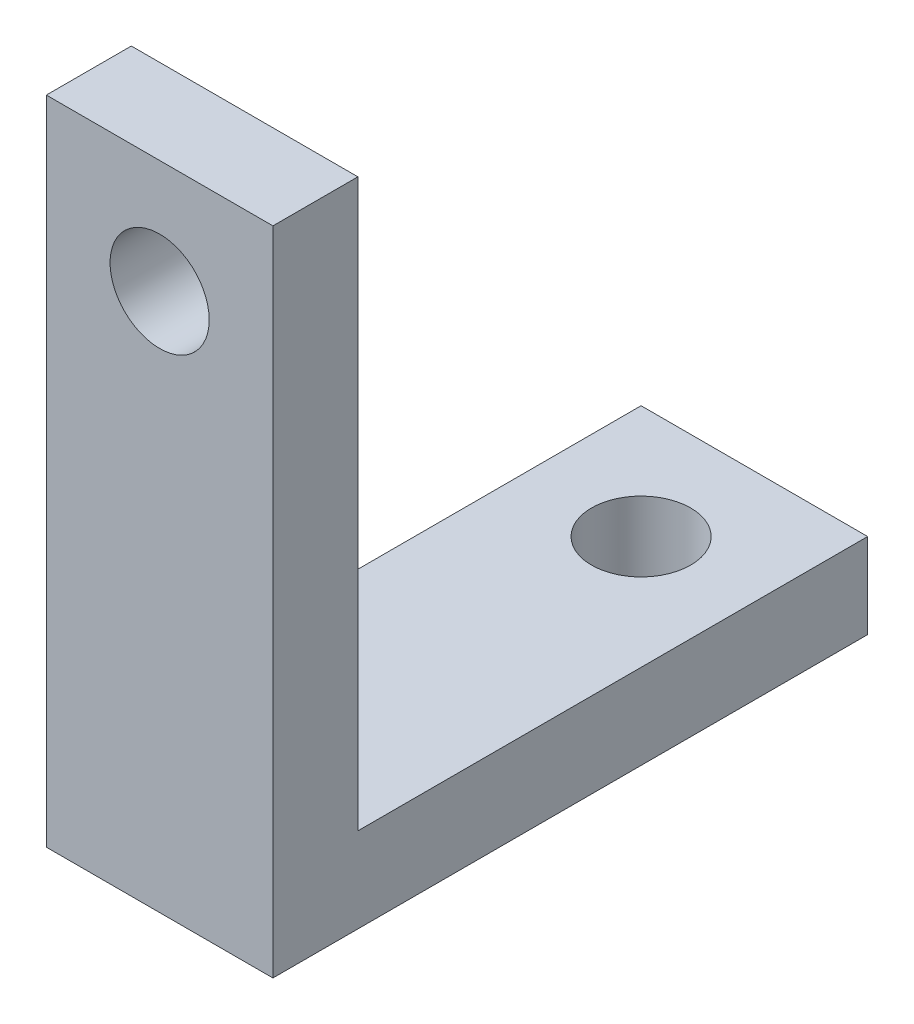
ISO-10303-21;
HEADER;
FILE_DESCRIPTION(('STEP AP214'),'2;1');
FILE_NAME('part.step','',(''),(''),'','','');
FILE_SCHEMA(('AUTOMOTIVE_DESIGN { 1 0 10303 214 1 1 1 1 }'));
ENDSEC;
DATA;
#1=APPLICATION_CONTEXT('core data for automotive mechanical design processes');
#2=APPLICATION_PROTOCOL_DEFINITION('international standard','automotive_design',2000,#1);
#3=PRODUCT_CONTEXT('',#1,'mechanical');
#4=PRODUCT('Part','Part','',(#3));
#5=PRODUCT_RELATED_PRODUCT_CATEGORY('part','',(#4));
#6=PRODUCT_DEFINITION_FORMATION('','',#4);
#7=PRODUCT_DEFINITION_CONTEXT('part definition',#1,'design');
#8=PRODUCT_DEFINITION('design','',#6,#7);
#9=PRODUCT_DEFINITION_SHAPE('','',#8);
#10=(LENGTH_UNIT() NAMED_UNIT(*) SI_UNIT(.MILLI.,.METRE.));
#11=(NAMED_UNIT(*) PLANE_ANGLE_UNIT() SI_UNIT($,.RADIAN.));
#12=(NAMED_UNIT(*) SI_UNIT($,.STERADIAN.) SOLID_ANGLE_UNIT());
#13=UNCERTAINTY_MEASURE_WITH_UNIT(LENGTH_MEASURE(1.E-05),#10,'distance_accuracy_value','');
#14=(GEOMETRIC_REPRESENTATION_CONTEXT(3) GLOBAL_UNCERTAINTY_ASSIGNED_CONTEXT((#13)) GLOBAL_UNIT_ASSIGNED_CONTEXT((#10,
#11,#12)) REPRESENTATION_CONTEXT('',''));
#15=CARTESIAN_POINT('',(0.,0.,0.));
#16=DIRECTION('',(0.,0.,1.));
#17=DIRECTION('',(1.,0.,0.));
#18=AXIS2_PLACEMENT_3D('',#15,#16,#17);
#19=CARTESIAN_POINT('',(0.,0.,0.));
#20=DIRECTION('',(0.,0.,1.));
#21=DIRECTION('',(1.,0.,0.));
#22=AXIS2_PLACEMENT_3D('',#19,#20,#21);
#23=PLANE('',#22);
#24=CARTESIAN_POINT('',(-48.2175292479687,13.1569331292858,0.));
#25=DIRECTION('',(0.,0.,1.));
#26=DIRECTION('',(1.,0.,0.));
#27=AXIS2_PLACEMENT_3D('',#24,#25,#26);
#28=CIRCLE('',#27,1.75);
#29=CARTESIAN_POINT('',(-46.4675292479687,13.1569331292858,0.));
#30=VERTEX_POINT('',#29);
#31=EDGE_CURVE('E147',#30,#30,#28,.T.);
#32=ORIENTED_EDGE('',*,*,#31,.T.);
#33=EDGE_LOOP('',(#32));
#34=FACE_BOUND('',#33,.T.);
#35=DIRECTION('',(1.,0.,0.));
#36=VECTOR('',#35,1.);
#37=CARTESIAN_POINT('',(-44.2175292479687,-2.84306687071421,0.));
#38=LINE('',#37,#36);
#39=CARTESIAN_POINT('',(-52.2175292479687,-2.84306687071421,0.));
#40=VERTEX_POINT('',#39);
#41=CARTESIAN_POINT('',(-44.2175292479687,-2.84306687071421,0.));
#42=VERTEX_POINT('',#41);
#43=EDGE_CURVE('E48',#40,#42,#38,.T.);
#44=ORIENTED_EDGE('',*,*,#43,.F.);
#45=DIRECTION('',(0.,-1.,0.));
#46=VECTOR('',#45,1.);
#47=CARTESIAN_POINT('',(-52.2175292479687,17.1569331292858,0.));
#48=LINE('',#47,#46);
#49=CARTESIAN_POINT('',(-52.2175292479687,17.1569331292858,0.));
#50=VERTEX_POINT('',#49);
#51=EDGE_CURVE('E116',#50,#40,#48,.T.);
#52=ORIENTED_EDGE('',*,*,#51,.F.);
#53=DIRECTION('',(-1.,0.,0.));
#54=VECTOR('',#53,1.);
#55=CARTESIAN_POINT('',(-52.2175292479687,17.1569331292858,0.));
#56=LINE('',#55,#54);
#57=CARTESIAN_POINT('',(-44.2175292479687,17.1569331292858,0.));
#58=VERTEX_POINT('',#57);
#59=EDGE_CURVE('E72',#58,#50,#56,.T.);
#60=ORIENTED_EDGE('',*,*,#59,.F.);
#61=DIRECTION('',(0.,1.,0.));
#62=VECTOR('',#61,1.);
#63=CARTESIAN_POINT('',(-44.2175292479687,17.1569331292858,0.));
#64=LINE('',#63,#62);
#65=EDGE_CURVE('E118',#42,#58,#64,.T.);
#66=ORIENTED_EDGE('',*,*,#65,.F.);
#67=EDGE_LOOP('',(#44,#52,#60,#66));
#68=FACE_BOUND('',#67,.T.);
#69=ADVANCED_FACE('F32',(#34,#68),#23,.F.);
#70=CARTESIAN_POINT('',(-52.2175292479687,17.1569331292858,3.));
#71=DIRECTION('',(1.,0.,0.));
#72=DIRECTION('',(0.,0.,-1.));
#73=AXIS2_PLACEMENT_3D('',#70,#71,#72);
#74=PLANE('',#73);
#75=ORIENTED_EDGE('',*,*,#51,.T.);
#76=DIRECTION('',(0.,0.,1.));
#77=VECTOR('',#76,1.);
#78=CARTESIAN_POINT('',(-52.2175292479687,-2.84306687071421,-18.));
#79=LINE('',#78,#77);
#80=CARTESIAN_POINT('',(-52.2175292479687,-2.84306687071421,-18.));
#81=VERTEX_POINT('',#80);
#82=EDGE_CURVE('E99',#81,#40,#79,.T.);
#83=ORIENTED_EDGE('',*,*,#82,.F.);
#84=DIRECTION('',(0.,1.,0.));
#85=VECTOR('',#84,1.);
#86=CARTESIAN_POINT('',(-52.2175292479687,-2.84306687071421,-18.));
#87=LINE('',#86,#85);
#88=CARTESIAN_POINT('',(-52.2175292479687,-5.84306687071421,-18.));
#89=VERTEX_POINT('',#88);
#90=EDGE_CURVE('E106',#89,#81,#87,.T.);
#91=ORIENTED_EDGE('',*,*,#90,.F.);
#92=DIRECTION('',(0.,0.,-1.));
#93=VECTOR('',#92,1.);
#94=CARTESIAN_POINT('',(-52.2175292479687,-5.84306687071421,3.));
#95=LINE('',#94,#93);
#96=CARTESIAN_POINT('',(-52.2175292479687,-5.84306687071421,3.));
#97=VERTEX_POINT('',#96);
#98=EDGE_CURVE('E11',#97,#89,#95,.T.);
#99=ORIENTED_EDGE('',*,*,#98,.F.);
#100=DIRECTION('',(0.,-1.,0.));
#101=VECTOR('',#100,1.);
#102=CARTESIAN_POINT('',(-52.2175292479687,17.1569331292858,3.));
#103=LINE('',#102,#101);
#104=CARTESIAN_POINT('',(-52.2175292479687,17.1569331292858,3.));
#105=VERTEX_POINT('',#104);
#106=EDGE_CURVE('E123',#105,#97,#103,.T.);
#107=ORIENTED_EDGE('',*,*,#106,.F.);
#108=DIRECTION('',(0.,0.,-1.));
#109=VECTOR('',#108,1.);
#110=CARTESIAN_POINT('',(-52.2175292479687,17.1569331292858,3.));
#111=LINE('',#110,#109);
#112=EDGE_CURVE('E128',#105,#50,#111,.T.);
#113=ORIENTED_EDGE('',*,*,#112,.T.);
#114=EDGE_LOOP('',(#75,#83,#91,#99,#107,#113));
#115=FACE_BOUND('',#114,.T.);
#116=ADVANCED_FACE('F34',(#115),#74,.F.);
#117=CARTESIAN_POINT('',(-52.2175292479687,-5.84306687071421,3.));
#118=DIRECTION('',(0.,1.,0.));
#119=DIRECTION('',(0.,0.,1.));
#120=AXIS2_PLACEMENT_3D('',#117,#118,#119);
#121=PLANE('',#120);
#122=CARTESIAN_POINT('',(-48.2175292479687,-5.84306687071421,-14.));
#123=DIRECTION('',(0.,-1.,0.));
#124=DIRECTION('',(0.,0.,-1.));
#125=AXIS2_PLACEMENT_3D('',#122,#123,#124);
#126=CIRCLE('',#125,1.75);
#127=CARTESIAN_POINT('',(-48.2175292479687,-5.84306687071421,-15.75));
#128=VERTEX_POINT('',#127);
#129=EDGE_CURVE('E143',#128,#128,#126,.T.);
#130=ORIENTED_EDGE('',*,*,#129,.F.);
#131=EDGE_LOOP('',(#130));
#132=FACE_BOUND('',#131,.T.);
#133=ORIENTED_EDGE('',*,*,#98,.T.);
#134=DIRECTION('',(-1.,0.,0.));
#135=VECTOR('',#134,1.);
#136=CARTESIAN_POINT('',(-52.2175292479687,-5.84306687071421,-18.));
#137=LINE('',#136,#135);
#138=CARTESIAN_POINT('',(-44.2175292479687,-5.84306687071421,-18.));
#139=VERTEX_POINT('',#138);
#140=EDGE_CURVE('E112',#139,#89,#137,.T.);
#141=ORIENTED_EDGE('',*,*,#140,.F.);
#142=DIRECTION('',(0.,0.,-1.));
#143=VECTOR('',#142,1.);
#144=CARTESIAN_POINT('',(-44.2175292479687,-5.84306687071421,3.));
#145=LINE('',#144,#143);
#146=CARTESIAN_POINT('',(-44.2175292479687,-5.84306687071421,3.));
#147=VERTEX_POINT('',#146);
#148=EDGE_CURVE('E41',#147,#139,#145,.T.);
#149=ORIENTED_EDGE('',*,*,#148,.F.);
#150=DIRECTION('',(1.,0.,0.));
#151=VECTOR('',#150,1.);
#152=CARTESIAN_POINT('',(-52.2175292479687,-5.84306687071421,3.));
#153=LINE('',#152,#151);
#154=EDGE_CURVE('E79',#97,#147,#153,.T.);
#155=ORIENTED_EDGE('',*,*,#154,.F.);
#156=EDGE_LOOP('',(#133,#141,#149,#155));
#157=FACE_BOUND('',#156,.T.);
#158=ADVANCED_FACE('F140',(#132,#157),#121,.F.);
#159=CARTESIAN_POINT('',(-44.2175292479687,17.1569331292858,3.));
#160=DIRECTION('',(-1.,0.,0.));
#161=DIRECTION('',(0.,0.,1.));
#162=AXIS2_PLACEMENT_3D('',#159,#160,#161);
#163=PLANE('',#162);
#164=ORIENTED_EDGE('',*,*,#148,.T.);
#165=DIRECTION('',(0.,-1.,0.));
#166=VECTOR('',#165,1.);
#167=CARTESIAN_POINT('',(-44.2175292479687,-5.84306687071421,-18.));
#168=LINE('',#167,#166);
#169=CARTESIAN_POINT('',(-44.2175292479687,-2.84306687071421,-18.));
#170=VERTEX_POINT('',#169);
#171=EDGE_CURVE('E105',#170,#139,#168,.T.);
#172=ORIENTED_EDGE('',*,*,#171,.F.);
#173=DIRECTION('',(0.,0.,1.));
#174=VECTOR('',#173,1.);
#175=CARTESIAN_POINT('',(-44.2175292479687,-2.84306687071421,-18.));
#176=LINE('',#175,#174);
#177=EDGE_CURVE('E101',#170,#42,#176,.T.);
#178=ORIENTED_EDGE('',*,*,#177,.T.);
#179=ORIENTED_EDGE('',*,*,#65,.T.);
#180=DIRECTION('',(0.,0.,-1.));
#181=VECTOR('',#180,1.);
#182=CARTESIAN_POINT('',(-44.2175292479687,17.1569331292858,3.));
#183=LINE('',#182,#181);
#184=CARTESIAN_POINT('',(-44.2175292479687,17.1569331292858,3.));
#185=VERTEX_POINT('',#184);
#186=EDGE_CURVE('E133',#185,#58,#183,.T.);
#187=ORIENTED_EDGE('',*,*,#186,.F.);
#188=DIRECTION('',(0.,1.,0.));
#189=VECTOR('',#188,1.);
#190=CARTESIAN_POINT('',(-44.2175292479687,17.1569331292858,3.));
#191=LINE('',#190,#189);
#192=EDGE_CURVE('E126',#147,#185,#191,.T.);
#193=ORIENTED_EDGE('',*,*,#192,.F.);
#194=EDGE_LOOP('',(#164,#172,#178,#179,#187,#193));
#195=FACE_BOUND('',#194,.T.);
#196=ADVANCED_FACE('F137',(#195),#163,.F.);
#197=CARTESIAN_POINT('',(-52.2175292479687,17.1569331292858,3.));
#198=DIRECTION('',(0.,-1.,0.));
#199=DIRECTION('',(0.,0.,-1.));
#200=AXIS2_PLACEMENT_3D('',#197,#198,#199);
#201=PLANE('',#200);
#202=ORIENTED_EDGE('',*,*,#59,.T.);
#203=ORIENTED_EDGE('',*,*,#112,.F.);
#204=DIRECTION('',(-1.,0.,0.));
#205=VECTOR('',#204,1.);
#206=CARTESIAN_POINT('',(-52.2175292479687,17.1569331292858,3.));
#207=LINE('',#206,#205);
#208=EDGE_CURVE('E57',#185,#105,#207,.T.);
#209=ORIENTED_EDGE('',*,*,#208,.F.);
#210=ORIENTED_EDGE('',*,*,#186,.T.);
#211=EDGE_LOOP('',(#202,#203,#209,#210));
#212=FACE_BOUND('',#211,.T.);
#213=ADVANCED_FACE('F163',(#212),#201,.F.);
#214=CARTESIAN_POINT('',(0.,0.,3.));
#215=DIRECTION('',(0.,0.,1.));
#216=DIRECTION('',(1.,0.,0.));
#217=AXIS2_PLACEMENT_3D('',#214,#215,#216);
#218=PLANE('',#217);
#219=CARTESIAN_POINT('',(-48.2175292479687,13.1569331292858,3.));
#220=DIRECTION('',(0.,0.,1.));
#221=DIRECTION('',(1.,0.,0.));
#222=AXIS2_PLACEMENT_3D('',#219,#220,#221);
#223=CIRCLE('',#222,1.75);
#224=CARTESIAN_POINT('',(-46.4675292479687,13.1569331292858,3.));
#225=VERTEX_POINT('',#224);
#226=EDGE_CURVE('E152',#225,#225,#223,.T.);
#227=ORIENTED_EDGE('',*,*,#226,.F.);
#228=EDGE_LOOP('',(#227));
#229=FACE_BOUND('',#228,.T.);
#230=ORIENTED_EDGE('',*,*,#106,.T.);
#231=ORIENTED_EDGE('',*,*,#154,.T.);
#232=ORIENTED_EDGE('',*,*,#192,.T.);
#233=ORIENTED_EDGE('',*,*,#208,.T.);
#234=EDGE_LOOP('',(#230,#231,#232,#233));
#235=FACE_BOUND('',#234,.T.);
#236=ADVANCED_FACE('F161',(#229,#235),#218,.T.);
#237=CARTESIAN_POINT('',(-44.2175292479687,-2.84306687071421,-18.));
#238=DIRECTION('',(0.,-1.,0.));
#239=DIRECTION('',(1.,0.,0.));
#240=AXIS2_PLACEMENT_3D('',#237,#238,#239);
#241=PLANE('',#240);
#242=CARTESIAN_POINT('',(-48.2175292479687,-2.84306687071421,-14.));
#243=DIRECTION('',(0.,-1.,0.));
#244=DIRECTION('',(1.,0.,0.));
#245=AXIS2_PLACEMENT_3D('',#242,#243,#244);
#246=CIRCLE('',#245,1.75);
#247=CARTESIAN_POINT('',(-46.4675292479687,-2.84306687071421,-14.));
#248=VERTEX_POINT('',#247);
#249=EDGE_CURVE('E36',#248,#248,#246,.T.);
#250=ORIENTED_EDGE('',*,*,#249,.T.);
#251=EDGE_LOOP('',(#250));
#252=FACE_BOUND('',#251,.T.);
#253=ORIENTED_EDGE('',*,*,#43,.T.);
#254=ORIENTED_EDGE('',*,*,#177,.F.);
#255=DIRECTION('',(1.,0.,0.));
#256=VECTOR('',#255,1.);
#257=CARTESIAN_POINT('',(-44.2175292479687,-2.84306687071421,-18.));
#258=LINE('',#257,#256);
#259=EDGE_CURVE('E95',#81,#170,#258,.T.);
#260=ORIENTED_EDGE('',*,*,#259,.F.);
#261=ORIENTED_EDGE('',*,*,#82,.T.);
#262=EDGE_LOOP('',(#253,#254,#260,#261));
#263=FACE_BOUND('',#262,.T.);
#264=ADVANCED_FACE('F97',(#252,#263),#241,.F.);
#265=CARTESIAN_POINT('',(0.,0.,-18.));
#266=DIRECTION('',(0.,0.,1.));
#267=DIRECTION('',(1.,0.,0.));
#268=AXIS2_PLACEMENT_3D('',#265,#266,#267);
#269=PLANE('',#268);
#270=ORIENTED_EDGE('',*,*,#90,.T.);
#271=ORIENTED_EDGE('',*,*,#259,.T.);
#272=ORIENTED_EDGE('',*,*,#171,.T.);
#273=ORIENTED_EDGE('',*,*,#140,.T.);
#274=EDGE_LOOP('',(#270,#271,#272,#273));
#275=FACE_BOUND('',#274,.T.);
#276=ADVANCED_FACE('F110',(#275),#269,.F.);
#277=CARTESIAN_POINT('',(-48.2175292479687,2.15693312928579,-14.));
#278=DIRECTION('',(0.,-1.,0.));
#279=DIRECTION('',(0.,0.,-1.));
#280=AXIS2_PLACEMENT_3D('',#277,#278,#279);
#281=CYLINDRICAL_SURFACE('',#280,1.75);
#282=ORIENTED_EDGE('',*,*,#129,.T.);
#283=EDGE_LOOP('',(#282));
#284=FACE_BOUND('',#283,.T.);
#285=ORIENTED_EDGE('',*,*,#249,.F.);
#286=EDGE_LOOP('',(#285));
#287=FACE_BOUND('',#286,.T.);
#288=ADVANCED_FACE('F183',(#284,#287),#281,.F.);
#289=CARTESIAN_POINT('',(-48.2175292479687,13.1569331292858,-5.));
#290=DIRECTION('',(0.,0.,1.));
#291=DIRECTION('',(1.,0.,0.));
#292=AXIS2_PLACEMENT_3D('',#289,#290,#291);
#293=CYLINDRICAL_SURFACE('',#292,1.75);
#294=ORIENTED_EDGE('',*,*,#226,.T.);
#295=EDGE_LOOP('',(#294));
#296=FACE_BOUND('',#295,.T.);
#297=ORIENTED_EDGE('',*,*,#31,.F.);
#298=EDGE_LOOP('',(#297));
#299=FACE_BOUND('',#298,.T.);
#300=ADVANCED_FACE('F158',(#296,#299),#293,.F.);
#301=CLOSED_SHELL('',(#69,#116,#158,#196,#213,#236,#264,#276,#288,#300));
#302=MANIFOLD_SOLID_BREP('B2',#301);
#303=ADVANCED_BREP_SHAPE_REPRESENTATION('',(#18,#302),#14);
#304=SHAPE_DEFINITION_REPRESENTATION(#9,#303);
ENDSEC;
END-ISO-10303-21;
